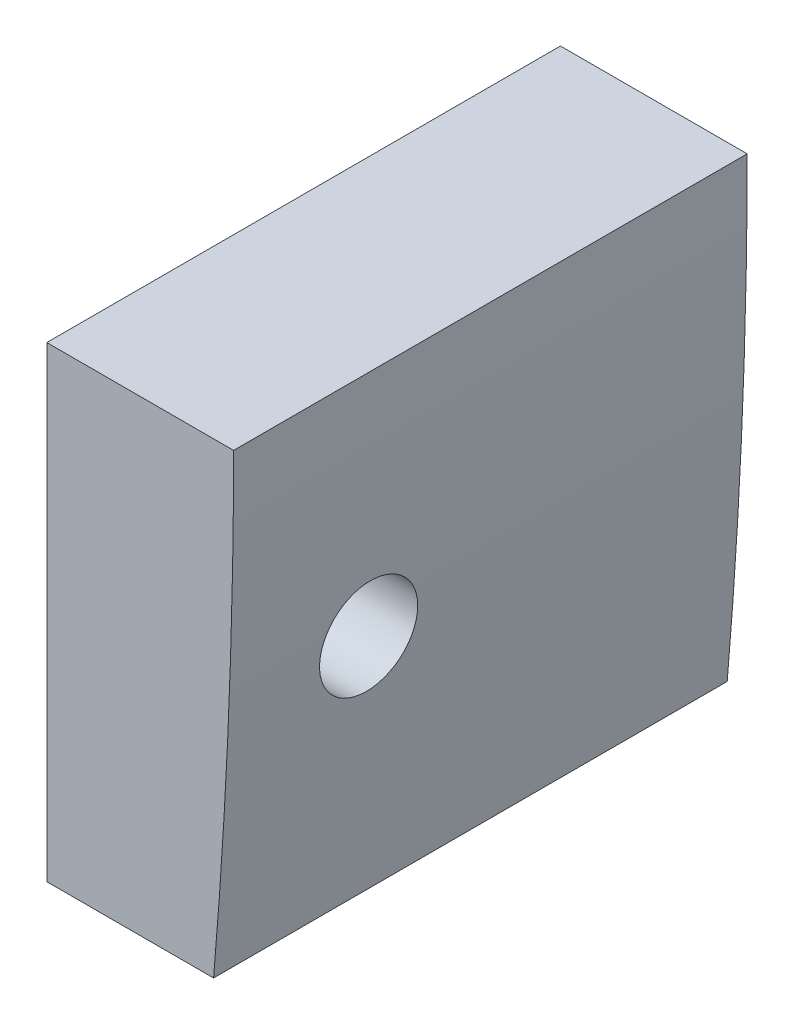
ISO-10303-21;
HEADER;
FILE_DESCRIPTION(('STEP AP214'),'2;1');
FILE_NAME('part.step','',(''),(''),'','','');
FILE_SCHEMA(('AUTOMOTIVE_DESIGN { 1 0 10303 214 1 1 1 1 }'));
ENDSEC;
DATA;
#1=APPLICATION_CONTEXT('core data for automotive mechanical design processes');
#2=APPLICATION_PROTOCOL_DEFINITION('international standard','automotive_design',2000,#1);
#3=PRODUCT_CONTEXT('',#1,'mechanical');
#4=PRODUCT('Part','Part','',(#3));
#5=PRODUCT_RELATED_PRODUCT_CATEGORY('part','',(#4));
#6=PRODUCT_DEFINITION_FORMATION('','',#4);
#7=PRODUCT_DEFINITION_CONTEXT('part definition',#1,'design');
#8=PRODUCT_DEFINITION('design','',#6,#7);
#9=PRODUCT_DEFINITION_SHAPE('','',#8);
#10=(LENGTH_UNIT() NAMED_UNIT(*) SI_UNIT(.MILLI.,.METRE.));
#11=(NAMED_UNIT(*) PLANE_ANGLE_UNIT() SI_UNIT($,.RADIAN.));
#12=(NAMED_UNIT(*) SI_UNIT($,.STERADIAN.) SOLID_ANGLE_UNIT());
#13=UNCERTAINTY_MEASURE_WITH_UNIT(LENGTH_MEASURE(1.E-05),#10,'distance_accuracy_value','');
#14=(GEOMETRIC_REPRESENTATION_CONTEXT(3) GLOBAL_UNCERTAINTY_ASSIGNED_CONTEXT((#13)) GLOBAL_UNIT_ASSIGNED_CONTEXT((#10,
#11,#12)) REPRESENTATION_CONTEXT('',''));
#15=CARTESIAN_POINT('',(0.,0.,0.));
#16=DIRECTION('',(0.,0.,1.));
#17=DIRECTION('',(1.,0.,0.));
#18=AXIS2_PLACEMENT_3D('',#15,#16,#17);
#19=CARTESIAN_POINT('',(135.625186397371,18.5740603380931,-10.));
#20=CARTESIAN_POINT('',(136.479179266911,28.557389440406,-10.));
#21=CARTESIAN_POINT('',(136.481143944612,38.5740603380931,-10.));
#22=B_SPLINE_CURVE_WITH_KNOTS('',2,(#19,#20,#21),.UNSPECIFIED.,.F.,.F.,(3,3),(0.,1.),.UNSPECIFIED.);
#23=DIRECTION('',(0.,0.,1.));
#24=VECTOR('',#23,1.);
#25=SURFACE_OF_LINEAR_EXTRUSION('',#22,#24);
#26=CARTESIAN_POINT('',(136.266528810224,28.5740603380931,8.1));
#27=CARTESIAN_POINT('',(136.271574944204,28.6920675596327,8.0999947852734));
#28=CARTESIAN_POINT('',(136.276535051306,28.8101639190569,8.09001986829075));
#29=CARTESIAN_POINT('',(136.28614625272,29.043113303656,8.05036106836557));
#30=CARTESIAN_POINT('',(136.290796969439,29.1579622707658,8.02065357132553));
#31=CARTESIAN_POINT('',(136.299673174514,29.3810094719069,7.94236716030812));
#32=CARTESIAN_POINT('',(136.303898852545,29.4892106640694,7.89379671145994));
#33=CARTESIAN_POINT('',(136.311839283781,29.6958983108871,7.77916921139424));
#34=CARTESIAN_POINT('',(136.315554164191,29.7943871824905,7.71311652584809));
#35=CARTESIAN_POINT('',(136.322409113436,29.9788413925098,7.56542103266495));
#36=CARTESIAN_POINT('',(136.325549419556,30.0648118976511,7.48378468923044));
#37=CARTESIAN_POINT('',(136.331212907917,30.2218302111981,7.30721570789268));
#38=CARTESIAN_POINT('',(136.333736068148,30.2928774873408,7.21228259593821));
#39=CARTESIAN_POINT('',(136.338135028961,30.4179738850428,7.01189140660986));
#40=CARTESIAN_POINT('',(136.340011294833,30.4720352215495,6.90644096469535));
#41=CARTESIAN_POINT('',(136.343102218856,30.5616883725661,6.68795232561278));
#42=CARTESIAN_POINT('',(136.344316880261,30.5972802779298,6.57491416577286));
#43=CARTESIAN_POINT('',(136.346075459726,30.6489675250084,6.34451721075402));
#44=CARTESIAN_POINT('',(136.346619699948,30.6650722309975,6.22716051873837));
#45=CARTESIAN_POINT('',(136.347035167038,30.6773574249482,5.99140796551602));
#46=CARTESIAN_POINT('',(136.34690639614,30.6735379790235,5.87301210775884));
#47=CARTESIAN_POINT('',(136.345976696473,30.6460865903992,5.63856669158774));
#48=CARTESIAN_POINT('',(136.345175901229,30.6224585834469,5.52251667177168));
#49=CARTESIAN_POINT('',(136.342907485634,30.5560682024311,5.29603227509113));
#50=CARTESIAN_POINT('',(136.34143986471,30.5133058118967,5.18559790306067));
#51=CARTESIAN_POINT('',(136.337849030055,30.4098596286157,4.97346835901106));
#52=CARTESIAN_POINT('',(136.335725758608,30.3491742581582,4.87177395736546));
#53=CARTESIAN_POINT('',(136.330844380064,30.2116107687611,4.68001812065661));
#54=CARTESIAN_POINT('',(136.328086272379,30.1347326348278,4.58995669636513));
#55=CARTESIAN_POINT('',(136.321967948625,29.9669382328067,4.42398548963515));
#56=CARTESIAN_POINT('',(136.318607506528,29.876016696656,4.34808104154978));
#57=CARTESIAN_POINT('',(136.311336332313,29.6827413204003,4.21261268962165));
#58=CARTESIAN_POINT('',(136.307425598456,29.580387444195,4.15304883738031));
#59=CARTESIAN_POINT('',(136.299123013898,29.3670857632836,4.0519109159732));
#60=CARTESIAN_POINT('',(136.294730859987,29.2561325555771,4.01034826686265));
#61=CARTESIAN_POINT('',(136.28556246296,29.0288386931602,3.94643880581189));
#62=CARTESIAN_POINT('',(136.280786218207,28.9124980155065,3.92409207571303));
#63=CARTESIAN_POINT('',(136.270964665104,28.6776401715098,3.89923214949826));
#64=CARTESIAN_POINT('',(136.265919159674,28.5591214537723,3.89673368705503));
#65=CARTESIAN_POINT('',(136.255703527015,28.3233529146983,3.91167567940283));
#66=CARTESIAN_POINT('',(136.250533399294,28.2061030983639,3.92911621276354));
#67=CARTESIAN_POINT('',(136.240225519606,27.9761352004693,3.9834553490934));
#68=CARTESIAN_POINT('',(136.235087786181,27.8634195452964,4.02036422500252));
#69=CARTESIAN_POINT('',(136.225020086334,27.6457848375049,4.11260159060274));
#70=CARTESIAN_POINT('',(136.220090120075,27.5408657909765,4.16793009468208));
#71=CARTESIAN_POINT('',(136.210615769853,27.3418121769782,4.2954374200586));
#72=CARTESIAN_POINT('',(136.206071359593,27.2476768738173,4.36761509084642));
#73=CARTESIAN_POINT('',(136.19754092158,27.0728622096676,4.52677992193811));
#74=CARTESIAN_POINT('',(136.193554891993,26.9921828044467,4.61376703355866));
#75=CARTESIAN_POINT('',(136.186303178307,26.8466411229129,4.80000887767955));
#76=CARTESIAN_POINT('',(136.183036914779,26.7817661191574,4.89925364125023));
#77=CARTESIAN_POINT('',(136.177355520535,26.669602878739,5.10725017639433));
#78=CARTESIAN_POINT('',(136.174940383022,26.6223145016082,5.21600187202533));
#79=CARTESIAN_POINT('',(136.171065955277,26.5467246676957,5.43978446128822));
#80=CARTESIAN_POINT('',(136.169605514187,26.518400349308,5.55480761288828));
#81=CARTESIAN_POINT('',(136.167698673012,26.4814583286497,5.78798435760033));
#82=CARTESIAN_POINT('',(136.167252268602,26.472840542334,5.90613793735938));
#83=CARTESIAN_POINT('',(136.167392795015,26.4755572467969,6.14210812944174));
#84=CARTESIAN_POINT('',(136.167978797094,26.4868738048037,6.25992494922342));
#85=CARTESIAN_POINT('',(136.170156966562,26.5291005265246,6.49198367865469));
#86=CARTESIAN_POINT('',(136.171749134776,26.5600107062848,6.60622558537654));
#87=CARTESIAN_POINT('',(136.175871398528,26.6405416968378,6.82789600274278));
#88=CARTESIAN_POINT('',(136.178401509565,26.6901628167822,6.93532440077665));
#89=CARTESIAN_POINT('',(136.18429305,26.8066983243301,7.14032099464985));
#90=CARTESIAN_POINT('',(136.187654450303,26.8736121066772,7.23788953542546));
#91=CARTESIAN_POINT('',(136.19507387904,27.0228887047383,7.42048746282288));
#92=CARTESIAN_POINT('',(136.199132454865,27.1052636646314,7.50550689817015));
#93=CARTESIAN_POINT('',(136.207785287482,27.2831144998886,7.66053499497465));
#94=CARTESIAN_POINT('',(136.212379680432,27.3785937063583,7.73053982808006));
#95=CARTESIAN_POINT('',(136.221937499219,27.5800855460894,7.85364017747288));
#96=CARTESIAN_POINT('',(136.226901533111,27.6861156363141,7.9067070376799));
#97=CARTESIAN_POINT('',(136.237010943649,27.9054895640718,7.99422357294991));
#98=CARTESIAN_POINT('',(136.242156096599,28.0188245140633,8.02869541048266));
#99=CARTESIAN_POINT('',(136.250529900465,28.2064071708923,8.06888948317736));
#100=CARTESIAN_POINT('',(136.25375635785,28.2794376496414,8.0805411790921));
#101=CARTESIAN_POINT('',(136.260176055387,28.4263205495796,8.09609807262372));
#102=CARTESIAN_POINT('',(136.263369295516,28.5001729713168,8.1000032650749));
#103=CARTESIAN_POINT('',(136.266528810224,28.5740603380931,8.1));
#104=B_SPLINE_CURVE_WITH_KNOTS('',3,(#26,#27,#28,#29,#30,#31,#32,#33,#34,#35,#36,#37,#38,#39,
#40,#41,#42,#43,#44,#45,#46,#47,#48,#49,#50,#51,#52,#53,#54,#55,#56,#57,#58,#59,#60,#61,#62,#63,
#64,#65,#66,#67,#68,#69,#70,#71,#72,#73,#74,#75,#76,#77,#78,#79,#80,#81,#82,#83,#84,#85,#86,#87,
#88,#89,#90,#91,#92,#93,#94,#95,#96,#97,#98,#99,#100,#101,#102,#103),.UNSPECIFIED.,.T.,.F.,(4,2,
2,2,2,2,2,2,2,2,2,2,2,2,2,2,2,2,2,2,2,2,2,2,2,2,2,2,2,2,2,2,2,2,2,2,2,2,4),(0.,
0.354075479794335,0.708575449093784,1.06291651289133,1.4171691738436,1.77127520655701,
2.12539386693541,2.47925728716744,2.83311896667866,3.18681053578346,3.54050093124845,
3.89412106890141,4.24774151095039,4.60139309052396,4.95504499756583,5.30882989272879,
5.66261590508432,6.01662603350204,6.3706376696551,6.72491206952808,7.07918786542511,
7.43365079077117,7.78811399300144,8.14255299854492,8.49699083895746,8.85114229641566,
9.20529092513107,9.55901184715196,9.91273126060867,10.2661326334833,10.6195342957737,
10.9729417974015,11.3263369311725,11.6800108141729,12.0337747683336,12.3881340951017,
12.7420701404297,12.963765787993,13.1854615833921),.UNSPECIFIED.);
#105=CARTESIAN_POINT('',(136.266528810224,28.5740603380931,8.1));
#106=VERTEX_POINT('',#105);
#107=EDGE_CURVE('E99',#106,#106,#104,.T.);
#108=ORIENTED_EDGE('',*,*,#107,.T.);
#109=EDGE_LOOP('',(#108));
#110=FACE_BOUND('',#109,.T.);
#111=DIRECTION('',(0.,0.,1.));
#112=VECTOR('',#111,1.);
#113=CARTESIAN_POINT('',(136.481143944612,38.5740603380931,-10.));
#114=LINE('',#113,#112);
#115=CARTESIAN_POINT('',(136.481143944612,38.5740603380931,-10.));
#116=VERTEX_POINT('',#115);
#117=CARTESIAN_POINT('',(136.481143944612,38.5740603380931,12.));
#118=VERTEX_POINT('',#117);
#119=EDGE_CURVE('E41',#116,#118,#114,.T.);
#120=ORIENTED_EDGE('',*,*,#119,.T.);
#121=CARTESIAN_POINT('',(135.625186397371,18.5740603380931,12.));
#122=CARTESIAN_POINT('',(136.479179266911,28.557389440406,12.));
#123=CARTESIAN_POINT('',(136.481143944612,38.5740603380931,12.));
#124=B_SPLINE_CURVE_WITH_KNOTS('',2,(#121,#122,#123),.UNSPECIFIED.,.F.,.F.,(3,3),(0.,1.),.UNSPECIFIED.);
#125=CARTESIAN_POINT('',(135.625186397371,18.5740603380931,12.));
#126=VERTEX_POINT('',#125);
#127=EDGE_CURVE('E78',#126,#118,#124,.T.);
#128=ORIENTED_EDGE('',*,*,#127,.F.);
#129=DIRECTION('',(0.,0.,1.));
#130=VECTOR('',#129,1.);
#131=CARTESIAN_POINT('',(135.625186397371,18.5740603380931,-10.));
#132=LINE('',#131,#130);
#133=CARTESIAN_POINT('',(135.625186397371,18.5740603380931,-10.));
#134=VERTEX_POINT('',#133);
#135=EDGE_CURVE('E11',#134,#126,#132,.T.);
#136=ORIENTED_EDGE('',*,*,#135,.F.);
#137=EDGE_CURVE('E79',#134,#116,#22,.T.);
#138=ORIENTED_EDGE('',*,*,#137,.T.);
#139=EDGE_LOOP('',(#120,#128,#136,#138));
#140=FACE_BOUND('',#139,.T.);
#141=ADVANCED_FACE('F37',(#110,#140),#25,.T.);
#142=CARTESIAN_POINT('',(128.481143944612,18.5740603380931,-10.));
#143=DIRECTION('',(0.,-1.,0.));
#144=DIRECTION('',(0.,0.,-1.));
#145=AXIS2_PLACEMENT_3D('',#142,#143,#144);
#146=PLANE('',#145);
#147=ORIENTED_EDGE('',*,*,#135,.T.);
#148=DIRECTION('',(1.,0.,0.));
#149=VECTOR('',#148,1.);
#150=CARTESIAN_POINT('',(128.481143944612,18.5740603380931,12.));
#151=LINE('',#150,#149);
#152=CARTESIAN_POINT('',(128.481143944612,18.5740603380931,12.));
#153=VERTEX_POINT('',#152);
#154=EDGE_CURVE('E95',#153,#126,#151,.T.);
#155=ORIENTED_EDGE('',*,*,#154,.F.);
#156=DIRECTION('',(0.,0.,1.));
#157=VECTOR('',#156,1.);
#158=CARTESIAN_POINT('',(128.481143944612,18.5740603380931,-10.));
#159=LINE('',#158,#157);
#160=CARTESIAN_POINT('',(128.481143944612,18.5740603380931,-10.));
#161=VERTEX_POINT('',#160);
#162=EDGE_CURVE('E46',#161,#153,#159,.T.);
#163=ORIENTED_EDGE('',*,*,#162,.F.);
#164=DIRECTION('',(1.,0.,0.));
#165=VECTOR('',#164,1.);
#166=CARTESIAN_POINT('',(128.481143944612,18.5740603380931,-10.));
#167=LINE('',#166,#165);
#168=EDGE_CURVE('E84',#161,#134,#167,.T.);
#169=ORIENTED_EDGE('',*,*,#168,.T.);
#170=EDGE_LOOP('',(#147,#155,#163,#169));
#171=FACE_BOUND('',#170,.T.);
#172=ADVANCED_FACE('F130',(#171),#146,.T.);
#173=CARTESIAN_POINT('',(128.481143944612,38.5740603380931,-10.));
#174=DIRECTION('',(-1.,0.,0.));
#175=DIRECTION('',(0.,0.,1.));
#176=AXIS2_PLACEMENT_3D('',#173,#174,#175);
#177=PLANE('',#176);
#178=ORIENTED_EDGE('',*,*,#162,.T.);
#179=DIRECTION('',(0.,-1.,0.));
#180=VECTOR('',#179,1.);
#181=CARTESIAN_POINT('',(128.481143944612,38.5740603380931,12.));
#182=LINE('',#181,#180);
#183=CARTESIAN_POINT('',(128.481143944612,38.5740603380931,12.));
#184=VERTEX_POINT('',#183);
#185=EDGE_CURVE('E91',#184,#153,#182,.T.);
#186=ORIENTED_EDGE('',*,*,#185,.F.);
#187=DIRECTION('',(0.,0.,1.));
#188=VECTOR('',#187,1.);
#189=CARTESIAN_POINT('',(128.481143944612,38.5740603380931,-10.));
#190=LINE('',#189,#188);
#191=CARTESIAN_POINT('',(128.481143944612,38.5740603380931,-10.));
#192=VERTEX_POINT('',#191);
#193=EDGE_CURVE('E83',#192,#184,#190,.T.);
#194=ORIENTED_EDGE('',*,*,#193,.F.);
#195=DIRECTION('',(0.,-1.,0.));
#196=VECTOR('',#195,1.);
#197=CARTESIAN_POINT('',(128.481143944612,38.5740603380931,-10.));
#198=LINE('',#197,#196);
#199=EDGE_CURVE('E123',#192,#161,#198,.T.);
#200=ORIENTED_EDGE('',*,*,#199,.T.);
#201=EDGE_LOOP('',(#178,#186,#194,#200));
#202=FACE_BOUND('',#201,.T.);
#203=ADVANCED_FACE('F127',(#202),#177,.T.);
#204=CARTESIAN_POINT('',(136.481143944612,38.5740603380931,-10.));
#205=DIRECTION('',(0.,1.,0.));
#206=DIRECTION('',(0.,0.,1.));
#207=AXIS2_PLACEMENT_3D('',#204,#205,#206);
#208=PLANE('',#207);
#209=ORIENTED_EDGE('',*,*,#193,.T.);
#210=DIRECTION('',(-1.,0.,0.));
#211=VECTOR('',#210,1.);
#212=CARTESIAN_POINT('',(136.481143944612,38.5740603380931,12.));
#213=LINE('',#212,#211);
#214=EDGE_CURVE('E86',#118,#184,#213,.T.);
#215=ORIENTED_EDGE('',*,*,#214,.F.);
#216=ORIENTED_EDGE('',*,*,#119,.F.);
#217=DIRECTION('',(-1.,0.,0.));
#218=VECTOR('',#217,1.);
#219=CARTESIAN_POINT('',(136.481143944612,38.5740603380931,-10.));
#220=LINE('',#219,#218);
#221=EDGE_CURVE('E118',#116,#192,#220,.T.);
#222=ORIENTED_EDGE('',*,*,#221,.T.);
#223=EDGE_LOOP('',(#209,#215,#216,#222));
#224=FACE_BOUND('',#223,.T.);
#225=ADVANCED_FACE('F87',(#224),#208,.T.);
#226=CARTESIAN_POINT('',(136.266172218951,28.5657248892495,-10.));
#227=DIRECTION('',(0.,0.,1.));
#228=DIRECTION('',(1.,0.,0.));
#229=AXIS2_PLACEMENT_3D('',#226,#227,#228);
#230=PLANE('',#229);
#231=ORIENTED_EDGE('',*,*,#137,.F.);
#232=ORIENTED_EDGE('',*,*,#168,.F.);
#233=ORIENTED_EDGE('',*,*,#199,.F.);
#234=ORIENTED_EDGE('',*,*,#221,.F.);
#235=EDGE_LOOP('',(#231,#232,#233,#234));
#236=FACE_BOUND('',#235,.T.);
#237=ADVANCED_FACE('F132',(#236),#230,.F.);
#238=CARTESIAN_POINT('',(136.266172218951,28.5657248892495,12.));
#239=DIRECTION('',(0.,0.,1.));
#240=DIRECTION('',(1.,0.,0.));
#241=AXIS2_PLACEMENT_3D('',#238,#239,#240);
#242=PLANE('',#241);
#243=ORIENTED_EDGE('',*,*,#127,.T.);
#244=ORIENTED_EDGE('',*,*,#214,.T.);
#245=ORIENTED_EDGE('',*,*,#185,.T.);
#246=ORIENTED_EDGE('',*,*,#154,.T.);
#247=EDGE_LOOP('',(#243,#244,#245,#246));
#248=FACE_BOUND('',#247,.T.);
#249=ADVANCED_FACE('F94',(#248),#242,.T.);
#250=CARTESIAN_POINT('',(136.482143944612,28.5740603380931,6.));
#251=DIRECTION('',(-1.,0.,0.));
#252=DIRECTION('',(0.,0.,1.));
#253=AXIS2_PLACEMENT_3D('',#250,#251,#252);
#254=CYLINDRICAL_SURFACE('',#253,2.1);
#255=ORIENTED_EDGE('',*,*,#107,.F.);
#256=EDGE_LOOP('',(#255));
#257=FACE_BOUND('',#256,.T.);
#258=CARTESIAN_POINT('',(130.481143944612,28.5740603380931,6.));
#259=DIRECTION('',(-1.,0.,0.));
#260=DIRECTION('',(0.,0.,1.));
#261=AXIS2_PLACEMENT_3D('',#258,#259,#260);
#262=CIRCLE('',#261,2.1);
#263=CARTESIAN_POINT('',(130.481143944612,28.5740603380931,8.1));
#264=VERTEX_POINT('',#263);
#265=EDGE_CURVE('E96',#264,#264,#262,.T.);
#266=ORIENTED_EDGE('',*,*,#265,.T.);
#267=EDGE_LOOP('',(#266));
#268=FACE_BOUND('',#267,.T.);
#269=ADVANCED_FACE('F139',(#257,#268),#254,.F.);
#270=CARTESIAN_POINT('',(130.481143944612,28.5740603380931,6.));
#271=DIRECTION('',(-1.,0.,0.));
#272=DIRECTION('',(0.,0.,1.));
#273=AXIS2_PLACEMENT_3D('',#270,#271,#272);
#274=PLANE('',#273);
#275=ORIENTED_EDGE('',*,*,#265,.F.);
#276=EDGE_LOOP('',(#275));
#277=FACE_BOUND('',#276,.T.);
#278=ADVANCED_FACE('F152',(#277),#274,.F.);
#279=CLOSED_SHELL('',(#141,#172,#203,#225,#237,#249,#269,#278));
#280=MANIFOLD_SOLID_BREP('B2',#279);
#281=ADVANCED_BREP_SHAPE_REPRESENTATION('',(#18,#280),#14);
#282=SHAPE_DEFINITION_REPRESENTATION(#9,#281);
ENDSEC;
END-ISO-10303-21;
